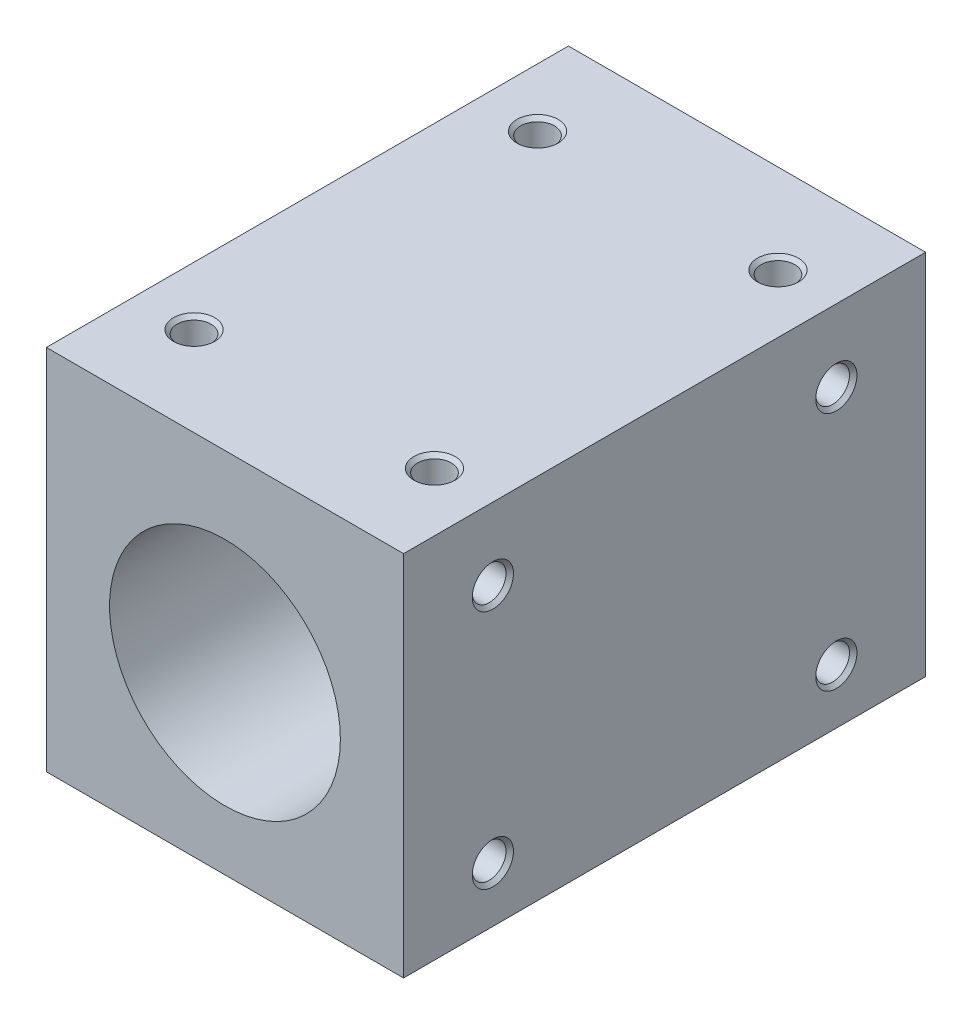
ISO-10303-21;
HEADER;
FILE_DESCRIPTION(('STEP AP214'),'2;1');
FILE_NAME('part.step','',(''),(''),'','','');
FILE_SCHEMA(('AUTOMOTIVE_DESIGN { 1 0 10303 214 1 1 1 1 }'));
ENDSEC;
DATA;
#1=APPLICATION_CONTEXT('core data for automotive mechanical design processes');
#2=APPLICATION_PROTOCOL_DEFINITION('international standard','automotive_design',2000,#1);
#3=PRODUCT_CONTEXT('',#1,'mechanical');
#4=PRODUCT('Part','Part','',(#3));
#5=PRODUCT_RELATED_PRODUCT_CATEGORY('part','',(#4));
#6=PRODUCT_DEFINITION_FORMATION('','',#4);
#7=PRODUCT_DEFINITION_CONTEXT('part definition',#1,'design');
#8=PRODUCT_DEFINITION('design','',#6,#7);
#9=PRODUCT_DEFINITION_SHAPE('','',#8);
#10=(LENGTH_UNIT() NAMED_UNIT(*) SI_UNIT(.MILLI.,.METRE.));
#11=(NAMED_UNIT(*) PLANE_ANGLE_UNIT() SI_UNIT($,.RADIAN.));
#12=(NAMED_UNIT(*) SI_UNIT($,.STERADIAN.) SOLID_ANGLE_UNIT());
#13=UNCERTAINTY_MEASURE_WITH_UNIT(LENGTH_MEASURE(1.E-05),#10,'distance_accuracy_value','');
#14=(GEOMETRIC_REPRESENTATION_CONTEXT(3) GLOBAL_UNCERTAINTY_ASSIGNED_CONTEXT((#13)) GLOBAL_UNIT_ASSIGNED_CONTEXT((#10,
#11,#12)) REPRESENTATION_CONTEXT('',''));
#15=CARTESIAN_POINT('',(0.,0.,0.));
#16=DIRECTION('',(0.,0.,1.));
#17=DIRECTION('',(1.,0.,0.));
#18=AXIS2_PLACEMENT_3D('',#15,#16,#17);
#19=CARTESIAN_POINT('',(18.9999999999486,17.5,-66.));
#20=DIRECTION('',(1.,0.,0.));
#21=DIRECTION('',(0.,0.,-1.));
#22=AXIS2_PLACEMENT_3D('',#19,#20,#21);
#23=CONICAL_SURFACE('',#22,2.45849999985921,1.04719755111137);
#24=CARTESIAN_POINT('',(17.5805843631451,17.5000000000978,-66.));
#25=VERTEX_POINT('',#24);
#26=VERTEX_LOOP('',#25);
#27=FACE_BOUND('',#26,.T.);
#28=CARTESIAN_POINT('',(19.,17.5,-66.));
#29=DIRECTION('',(1.,0.,0.));
#30=DIRECTION('',(0.,0.,-1.));
#31=AXIS2_PLACEMENT_3D('',#28,#29,#30);
#32=CIRCLE('',#31,2.4585);
#33=CARTESIAN_POINT('',(19.,17.5,-68.4585));
#34=VERTEX_POINT('',#33);
#35=EDGE_CURVE('E84',#34,#34,#32,.T.);
#36=ORIENTED_EDGE('',*,*,#35,.T.);
#37=EDGE_LOOP('',(#36));
#38=FACE_BOUND('',#37,.T.);
#39=ADVANCED_FACE('F17',(#27,#38),#23,.F.);
#40=CARTESIAN_POINT('',(18.9999999999486,-17.5,-16.));
#41=DIRECTION('',(1.,0.,0.));
#42=DIRECTION('',(0.,0.,-1.));
#43=AXIS2_PLACEMENT_3D('',#40,#41,#42);
#44=CONICAL_SURFACE('',#43,2.45849999994789,1.04719755114261);
#45=CARTESIAN_POINT('',(17.5805843631167,-17.5000000000284,-16.));
#46=VERTEX_POINT('',#45);
#47=VERTEX_LOOP('',#46);
#48=FACE_BOUND('',#47,.T.);
#49=CARTESIAN_POINT('',(19.,-17.5,-16.));
#50=DIRECTION('',(1.,0.,0.));
#51=DIRECTION('',(0.,0.,-1.));
#52=AXIS2_PLACEMENT_3D('',#49,#50,#51);
#53=CIRCLE('',#52,2.4585);
#54=CARTESIAN_POINT('',(19.,-17.5,-18.4585));
#55=VERTEX_POINT('',#54);
#56=EDGE_CURVE('E86',#55,#55,#53,.T.);
#57=ORIENTED_EDGE('',*,*,#56,.T.);
#58=EDGE_LOOP('',(#57));
#59=FACE_BOUND('',#58,.T.);
#60=ADVANCED_FACE('F81',(#48,#59),#44,.F.);
#61=CARTESIAN_POINT('',(18.9999999999486,-17.5,-66.));
#62=DIRECTION('',(1.,0.,0.));
#63=DIRECTION('',(0.,0.,-1.));
#64=AXIS2_PLACEMENT_3D('',#61,#62,#63);
#65=CONICAL_SURFACE('',#64,2.45849999994789,1.04719755114261);
#66=CARTESIAN_POINT('',(17.5805843630883,-17.4999999999273,-66.));
#67=VERTEX_POINT('',#66);
#68=VERTEX_LOOP('',#67);
#69=FACE_BOUND('',#68,.T.);
#70=CARTESIAN_POINT('',(19.,-17.5,-66.));
#71=DIRECTION('',(1.,0.,0.));
#72=DIRECTION('',(0.,0.,-1.));
#73=AXIS2_PLACEMENT_3D('',#70,#71,#72);
#74=CIRCLE('',#73,2.4585);
#75=CARTESIAN_POINT('',(19.,-17.5,-68.4585));
#76=VERTEX_POINT('',#75);
#77=EDGE_CURVE('E89',#76,#76,#74,.T.);
#78=ORIENTED_EDGE('',*,*,#77,.T.);
#79=EDGE_LOOP('',(#78));
#80=FACE_BOUND('',#79,.T.);
#81=ADVANCED_FACE('F173',(#69,#80),#65,.F.);
#82=CARTESIAN_POINT('',(18.9999999999486,17.5,-16.));
#83=DIRECTION('',(1.,0.,0.));
#84=DIRECTION('',(0.,0.,-1.));
#85=AXIS2_PLACEMENT_3D('',#82,#83,#84);
#86=CONICAL_SURFACE('',#85,2.45849999985921,1.04719755111137);
#87=CARTESIAN_POINT('',(17.5805843631167,17.4999999999432,-16.));
#88=VERTEX_POINT('',#87);
#89=VERTEX_LOOP('',#88);
#90=FACE_BOUND('',#89,.T.);
#91=CARTESIAN_POINT('',(19.,17.5,-16.));
#92=DIRECTION('',(1.,0.,0.));
#93=DIRECTION('',(0.,0.,-1.));
#94=AXIS2_PLACEMENT_3D('',#91,#92,#93);
#95=CIRCLE('',#94,2.4585);
#96=CARTESIAN_POINT('',(19.,17.5,-18.4585));
#97=VERTEX_POINT('',#96);
#98=EDGE_CURVE('E168',#97,#97,#95,.T.);
#99=ORIENTED_EDGE('',*,*,#98,.T.);
#100=EDGE_LOOP('',(#99));
#101=FACE_BOUND('',#100,.T.);
#102=ADVANCED_FACE('F281',(#90,#101),#86,.F.);
#103=CARTESIAN_POINT('',(-17.5,20.9999999999581,-16.));
#104=DIRECTION('',(0.,1.,0.));
#105=DIRECTION('',(0.,0.,1.));
#106=AXIS2_PLACEMENT_3D('',#103,#104,#105);
#107=CONICAL_SURFACE('',#106,2.45850000006158,1.04719755118266);
#108=CARTESIAN_POINT('',(-17.5,19.5805843630978,-16.));
#109=VERTEX_POINT('',#108);
#110=VERTEX_LOOP('',#109);
#111=FACE_BOUND('',#110,.T.);
#112=CARTESIAN_POINT('',(-17.5,21.,-16.));
#113=DIRECTION('',(0.,-1.,0.));
#114=DIRECTION('',(0.,0.,-1.));
#115=AXIS2_PLACEMENT_3D('',#112,#113,#114);
#116=CIRCLE('',#115,2.4585);
#117=CARTESIAN_POINT('',(-17.5,21.,-18.4585));
#118=VERTEX_POINT('',#117);
#119=EDGE_CURVE('E165',#118,#118,#116,.F.);
#120=ORIENTED_EDGE('',*,*,#119,.T.);
#121=EDGE_LOOP('',(#120));
#122=FACE_BOUND('',#121,.T.);
#123=ADVANCED_FACE('F278',(#111,#122),#107,.F.);
#124=CARTESIAN_POINT('',(17.5,20.9999999999013,-66.));
#125=DIRECTION('',(0.,1.,0.));
#126=DIRECTION('',(0.,0.,1.));
#127=AXIS2_PLACEMENT_3D('',#124,#125,#126);
#128=CONICAL_SURFACE('',#127,2.45849999985921,1.0471975511861);
#129=CARTESIAN_POINT('',(17.5000000000978,19.5805843630978,-66.));
#130=VERTEX_POINT('',#129);
#131=VERTEX_LOOP('',#130);
#132=FACE_BOUND('',#131,.T.);
#133=CARTESIAN_POINT('',(17.5,21.,-66.));
#134=DIRECTION('',(0.,-1.,0.));
#135=DIRECTION('',(0.,0.,-1.));
#136=AXIS2_PLACEMENT_3D('',#133,#134,#135);
#137=CIRCLE('',#136,2.4585);
#138=CARTESIAN_POINT('',(17.5,21.,-68.4585));
#139=VERTEX_POINT('',#138);
#140=EDGE_CURVE('E162',#139,#139,#137,.F.);
#141=ORIENTED_EDGE('',*,*,#140,.T.);
#142=EDGE_LOOP('',(#141));
#143=FACE_BOUND('',#142,.T.);
#144=ADVANCED_FACE('F280',(#132,#143),#128,.F.);
#145=CARTESIAN_POINT('',(-17.5,20.9999999999581,-66.));
#146=DIRECTION('',(0.,1.,0.));
#147=DIRECTION('',(0.,0.,1.));
#148=AXIS2_PLACEMENT_3D('',#145,#146,#147);
#149=CONICAL_SURFACE('',#148,2.45850000006158,1.04719755118266);
#150=CARTESIAN_POINT('',(-17.4999999998704,19.5805843630694,-66.));
#151=VERTEX_POINT('',#150);
#152=VERTEX_LOOP('',#151);
#153=FACE_BOUND('',#152,.T.);
#154=CARTESIAN_POINT('',(-17.5,21.,-66.));
#155=DIRECTION('',(0.,-1.,0.));
#156=DIRECTION('',(0.,0.,-1.));
#157=AXIS2_PLACEMENT_3D('',#154,#155,#156);
#158=CIRCLE('',#157,2.4585);
#159=CARTESIAN_POINT('',(-17.5,21.,-68.4585));
#160=VERTEX_POINT('',#159);
#161=EDGE_CURVE('E159',#160,#160,#158,.F.);
#162=ORIENTED_EDGE('',*,*,#161,.T.);
#163=EDGE_LOOP('',(#162));
#164=FACE_BOUND('',#163,.T.);
#165=ADVANCED_FACE('F289',(#153,#164),#149,.F.);
#166=CARTESIAN_POINT('',(17.5,20.9999999999013,-16.));
#167=DIRECTION('',(0.,1.,0.));
#168=DIRECTION('',(0.,0.,1.));
#169=AXIS2_PLACEMENT_3D('',#166,#167,#168);
#170=CONICAL_SURFACE('',#169,2.45849999985921,1.0471975511861);
#171=CARTESIAN_POINT('',(17.5,19.5805843631547,-16.));
#172=VERTEX_POINT('',#171);
#173=VERTEX_LOOP('',#172);
#174=FACE_BOUND('',#173,.T.);
#175=CARTESIAN_POINT('',(17.5,21.,-16.));
#176=DIRECTION('',(0.,-1.,0.));
#177=DIRECTION('',(0.,0.,-1.));
#178=AXIS2_PLACEMENT_3D('',#175,#176,#177);
#179=CIRCLE('',#178,2.4585);
#180=CARTESIAN_POINT('',(17.5,21.,-18.4585));
#181=VERTEX_POINT('',#180);
#182=EDGE_CURVE('E156',#181,#181,#179,.F.);
#183=ORIENTED_EDGE('',*,*,#182,.T.);
#184=EDGE_LOOP('',(#183));
#185=FACE_BOUND('',#184,.T.);
#186=ADVANCED_FACE('F474',(#174,#185),#170,.F.);
#187=CARTESIAN_POINT('',(22.22925,17.5,-66.));
#188=DIRECTION('',(1.,0.,0.));
#189=DIRECTION('',(0.,0.,-1.));
#190=AXIS2_PLACEMENT_3D('',#187,#188,#189);
#191=CYLINDRICAL_SURFACE('',#190,2.4585);
#192=CARTESIAN_POINT('',(25.4585000000134,17.5,-66.));
#193=DIRECTION('',(1.,0.,0.));
#194=DIRECTION('',(0.,1.,0.));
#195=AXIS2_PLACEMENT_3D('',#192,#193,#194);
#196=CIRCLE('',#195,2.45850000002975);
#197=CARTESIAN_POINT('',(25.4585000000134,19.9585000000297,-66.));
#198=VERTEX_POINT('',#197);
#199=EDGE_CURVE('E153',#198,#198,#196,.T.);
#200=ORIENTED_EDGE('',*,*,#199,.T.);
#201=EDGE_LOOP('',(#200));
#202=FACE_BOUND('',#201,.T.);
#203=ORIENTED_EDGE('',*,*,#35,.F.);
#204=EDGE_LOOP('',(#203));
#205=FACE_BOUND('',#204,.T.);
#206=ADVANCED_FACE('F190',(#202,#205),#191,.F.);
#207=CARTESIAN_POINT('',(22.22925,-17.5,-16.));
#208=DIRECTION('',(1.,0.,0.));
#209=DIRECTION('',(0.,0.,-1.));
#210=AXIS2_PLACEMENT_3D('',#207,#208,#209);
#211=CYLINDRICAL_SURFACE('',#210,2.4585);
#212=CARTESIAN_POINT('',(25.4585000000134,-17.5,-16.));
#213=DIRECTION('',(1.,0.,0.));
#214=DIRECTION('',(0.,1.,0.));
#215=AXIS2_PLACEMENT_3D('',#212,#213,#214);
#216=CIRCLE('',#215,2.45850000000474);
#217=CARTESIAN_POINT('',(25.4585000000134,-15.0414999999953,-16.));
#218=VERTEX_POINT('',#217);
#219=EDGE_CURVE('E150',#218,#218,#216,.T.);
#220=ORIENTED_EDGE('',*,*,#219,.T.);
#221=EDGE_LOOP('',(#220));
#222=FACE_BOUND('',#221,.T.);
#223=ORIENTED_EDGE('',*,*,#56,.F.);
#224=EDGE_LOOP('',(#223));
#225=FACE_BOUND('',#224,.T.);
#226=ADVANCED_FACE('F178',(#222,#225),#211,.F.);
#227=CARTESIAN_POINT('',(22.22925,-17.5,-66.));
#228=DIRECTION('',(1.,0.,0.));
#229=DIRECTION('',(0.,0.,-1.));
#230=AXIS2_PLACEMENT_3D('',#227,#228,#229);
#231=CYLINDRICAL_SURFACE('',#230,2.4585);
#232=CARTESIAN_POINT('',(25.4585000000134,-17.5,-66.));
#233=DIRECTION('',(1.,0.,0.));
#234=DIRECTION('',(0.,1.,0.));
#235=AXIS2_PLACEMENT_3D('',#232,#233,#234);
#236=CIRCLE('',#235,2.45850000000474);
#237=CARTESIAN_POINT('',(25.4585000000134,-15.0414999999953,-66.));
#238=VERTEX_POINT('',#237);
#239=EDGE_CURVE('E147',#238,#238,#236,.T.);
#240=ORIENTED_EDGE('',*,*,#239,.T.);
#241=EDGE_LOOP('',(#240));
#242=FACE_BOUND('',#241,.T.);
#243=ORIENTED_EDGE('',*,*,#77,.F.);
#244=EDGE_LOOP('',(#243));
#245=FACE_BOUND('',#244,.T.);
#246=ADVANCED_FACE('F175',(#242,#245),#231,.F.);
#247=CARTESIAN_POINT('',(22.22925,17.5,-16.));
#248=DIRECTION('',(1.,0.,0.));
#249=DIRECTION('',(0.,0.,-1.));
#250=AXIS2_PLACEMENT_3D('',#247,#248,#249);
#251=CYLINDRICAL_SURFACE('',#250,2.4585);
#252=CARTESIAN_POINT('',(25.4585000000134,17.5,-16.));
#253=DIRECTION('',(1.,0.,0.));
#254=DIRECTION('',(0.,1.,0.));
#255=AXIS2_PLACEMENT_3D('',#252,#253,#254);
#256=CIRCLE('',#255,2.45850000002975);
#257=CARTESIAN_POINT('',(25.4585000000134,19.9585000000297,-16.));
#258=VERTEX_POINT('',#257);
#259=EDGE_CURVE('E144',#258,#258,#256,.T.);
#260=ORIENTED_EDGE('',*,*,#259,.T.);
#261=EDGE_LOOP('',(#260));
#262=FACE_BOUND('',#261,.T.);
#263=ORIENTED_EDGE('',*,*,#98,.F.);
#264=EDGE_LOOP('',(#263));
#265=FACE_BOUND('',#264,.T.);
#266=ADVANCED_FACE('F177',(#262,#265),#251,.F.);
#267=CARTESIAN_POINT('',(-17.5,24.22925,-16.));
#268=DIRECTION('',(0.,-1.,0.));
#269=DIRECTION('',(0.,0.,-1.));
#270=AXIS2_PLACEMENT_3D('',#267,#268,#269);
#271=CYLINDRICAL_SURFACE('',#270,2.4585);
#272=CARTESIAN_POINT('',(-17.5,27.458500000023,-16.));
#273=DIRECTION('',(0.,1.,0.));
#274=DIRECTION('',(1.,0.,0.));
#275=AXIS2_PLACEMENT_3D('',#272,#273,#274);
#276=CIRCLE('',#275,2.45849999994789);
#277=CARTESIAN_POINT('',(-15.0415000000521,27.458500000023,-16.));
#278=VERTEX_POINT('',#277);
#279=EDGE_CURVE('E141',#278,#278,#276,.T.);
#280=ORIENTED_EDGE('',*,*,#279,.T.);
#281=EDGE_LOOP('',(#280));
#282=FACE_BOUND('',#281,.T.);
#283=ORIENTED_EDGE('',*,*,#119,.F.);
#284=EDGE_LOOP('',(#283));
#285=FACE_BOUND('',#284,.T.);
#286=ADVANCED_FACE('F187',(#282,#285),#271,.F.);
#287=CARTESIAN_POINT('',(17.5,24.22925,-66.));
#288=DIRECTION('',(0.,-1.,0.));
#289=DIRECTION('',(0.,0.,-1.));
#290=AXIS2_PLACEMENT_3D('',#287,#288,#289);
#291=CYLINDRICAL_SURFACE('',#290,2.4585);
#292=CARTESIAN_POINT('',(17.5,27.458500000023,-66.));
#293=DIRECTION('',(0.,1.,0.));
#294=DIRECTION('',(1.,0.,0.));
#295=AXIS2_PLACEMENT_3D('',#292,#293,#294);
#296=CIRCLE('',#295,2.4584999999729);
#297=CARTESIAN_POINT('',(19.9584999999729,27.458500000023,-66.));
#298=VERTEX_POINT('',#297);
#299=EDGE_CURVE('E134',#298,#298,#296,.T.);
#300=ORIENTED_EDGE('',*,*,#299,.T.);
#301=EDGE_LOOP('',(#300));
#302=FACE_BOUND('',#301,.T.);
#303=ORIENTED_EDGE('',*,*,#140,.F.);
#304=EDGE_LOOP('',(#303));
#305=FACE_BOUND('',#304,.T.);
#306=ADVANCED_FACE('F264',(#302,#305),#291,.F.);
#307=CARTESIAN_POINT('',(-17.5,24.22925,-66.));
#308=DIRECTION('',(0.,-1.,0.));
#309=DIRECTION('',(0.,0.,-1.));
#310=AXIS2_PLACEMENT_3D('',#307,#308,#309);
#311=CYLINDRICAL_SURFACE('',#310,2.4585);
#312=CARTESIAN_POINT('',(-17.5,27.458500000023,-66.));
#313=DIRECTION('',(0.,1.,0.));
#314=DIRECTION('',(1.,0.,0.));
#315=AXIS2_PLACEMENT_3D('',#312,#313,#314);
#316=CIRCLE('',#315,2.45849999994789);
#317=CARTESIAN_POINT('',(-15.0415000000521,27.458500000023,-66.));
#318=VERTEX_POINT('',#317);
#319=EDGE_CURVE('E129',#318,#318,#316,.T.);
#320=ORIENTED_EDGE('',*,*,#319,.T.);
#321=EDGE_LOOP('',(#320));
#322=FACE_BOUND('',#321,.T.);
#323=ORIENTED_EDGE('',*,*,#161,.F.);
#324=EDGE_LOOP('',(#323));
#325=FACE_BOUND('',#324,.T.);
#326=ADVANCED_FACE('F261',(#322,#325),#311,.F.);
#327=CARTESIAN_POINT('',(17.5,24.22925,-16.));
#328=DIRECTION('',(0.,-1.,0.));
#329=DIRECTION('',(0.,0.,-1.));
#330=AXIS2_PLACEMENT_3D('',#327,#328,#329);
#331=CYLINDRICAL_SURFACE('',#330,2.4585);
#332=CARTESIAN_POINT('',(17.5,27.458500000023,-16.));
#333=DIRECTION('',(0.,1.,0.));
#334=DIRECTION('',(1.,0.,0.));
#335=AXIS2_PLACEMENT_3D('',#332,#333,#334);
#336=CIRCLE('',#335,2.4584999999729);
#337=CARTESIAN_POINT('',(19.9584999999729,27.458500000023,-16.));
#338=VERTEX_POINT('',#337);
#339=EDGE_CURVE('E125',#338,#338,#336,.T.);
#340=ORIENTED_EDGE('',*,*,#339,.T.);
#341=EDGE_LOOP('',(#340));
#342=FACE_BOUND('',#341,.T.);
#343=ORIENTED_EDGE('',*,*,#182,.F.);
#344=EDGE_LOOP('',(#343));
#345=FACE_BOUND('',#344,.T.);
#346=ADVANCED_FACE('F257',(#342,#345),#331,.F.);
#347=CARTESIAN_POINT('',(25.9999999999536,17.5,-66.));
#348=DIRECTION('',(1.,0.,0.));
#349=DIRECTION('',(0.,0.,-1.));
#350=AXIS2_PLACEMENT_3D('',#347,#348,#349);
#351=CONICAL_SURFACE('',#350,2.99999999996998,0.785398163397448);
#352=CARTESIAN_POINT('',(26.0000000000104,17.5,-66.));
#353=DIRECTION('',(1.,0.,0.));
#354=DIRECTION('',(0.,0.,-1.));
#355=AXIS2_PLACEMENT_3D('',#352,#353,#354);
#356=CIRCLE('',#355,3.00000000002683);
#357=CARTESIAN_POINT('',(26.0000000000104,17.5,-69.0000000000268));
#358=VERTEX_POINT('',#357);
#359=EDGE_CURVE('E20',#358,#358,#356,.F.);
#360=ORIENTED_EDGE('',*,*,#359,.F.);
#361=EDGE_LOOP('',(#360));
#362=FACE_BOUND('',#361,.T.);
#363=ORIENTED_EDGE('',*,*,#199,.F.);
#364=EDGE_LOOP('',(#363));
#365=FACE_BOUND('',#364,.T.);
#366=ADVANCED_FACE('F253',(#362,#365),#351,.F.);
#367=CARTESIAN_POINT('',(25.9999999999536,-17.5,-16.));
#368=DIRECTION('',(1.,0.,0.));
#369=DIRECTION('',(0.,0.,-1.));
#370=AXIS2_PLACEMENT_3D('',#367,#368,#369);
#371=CONICAL_SURFACE('',#370,2.99999999994498,0.785398163397448);
#372=CARTESIAN_POINT('',(26.0000000000104,-17.5,-16.));
#373=DIRECTION('',(1.,0.,0.));
#374=DIRECTION('',(0.,0.,-1.));
#375=AXIS2_PLACEMENT_3D('',#372,#373,#374);
#376=CIRCLE('',#375,3.00000000000182);
#377=CARTESIAN_POINT('',(26.0000000000104,-17.5,-19.0000000000018));
#378=VERTEX_POINT('',#377);
#379=EDGE_CURVE('E120',#378,#378,#376,.F.);
#380=ORIENTED_EDGE('',*,*,#379,.F.);
#381=EDGE_LOOP('',(#380));
#382=FACE_BOUND('',#381,.T.);
#383=ORIENTED_EDGE('',*,*,#219,.F.);
#384=EDGE_LOOP('',(#383));
#385=FACE_BOUND('',#384,.T.);
#386=ADVANCED_FACE('F249',(#382,#385),#371,.F.);
#387=CARTESIAN_POINT('',(25.9999999999536,-17.5,-66.));
#388=DIRECTION('',(1.,0.,0.));
#389=DIRECTION('',(0.,0.,-1.));
#390=AXIS2_PLACEMENT_3D('',#387,#388,#389);
#391=CONICAL_SURFACE('',#390,2.99999999994498,0.785398163397448);
#392=CARTESIAN_POINT('',(26.0000000000104,-17.5,-66.));
#393=DIRECTION('',(1.,0.,0.));
#394=DIRECTION('',(0.,0.,-1.));
#395=AXIS2_PLACEMENT_3D('',#392,#393,#394);
#396=CIRCLE('',#395,3.00000000000182);
#397=CARTESIAN_POINT('',(26.0000000000104,-17.5,-69.0000000000018));
#398=VERTEX_POINT('',#397);
#399=EDGE_CURVE('E118',#398,#398,#396,.F.);
#400=ORIENTED_EDGE('',*,*,#399,.F.);
#401=EDGE_LOOP('',(#400));
#402=FACE_BOUND('',#401,.T.);
#403=ORIENTED_EDGE('',*,*,#239,.F.);
#404=EDGE_LOOP('',(#403));
#405=FACE_BOUND('',#404,.T.);
#406=ADVANCED_FACE('F245',(#402,#405),#391,.F.);
#407=CARTESIAN_POINT('',(25.9999999999536,17.5,-16.));
#408=DIRECTION('',(1.,0.,0.));
#409=DIRECTION('',(0.,0.,-1.));
#410=AXIS2_PLACEMENT_3D('',#407,#408,#409);
#411=CONICAL_SURFACE('',#410,2.99999999996998,0.785398163397448);
#412=CARTESIAN_POINT('',(26.0000000000104,17.5,-16.));
#413=DIRECTION('',(1.,0.,0.));
#414=DIRECTION('',(0.,0.,-1.));
#415=AXIS2_PLACEMENT_3D('',#412,#413,#414);
#416=CIRCLE('',#415,3.00000000002683);
#417=CARTESIAN_POINT('',(26.0000000000104,17.5,-19.0000000000268));
#418=VERTEX_POINT('',#417);
#419=EDGE_CURVE('E115',#418,#418,#416,.F.);
#420=ORIENTED_EDGE('',*,*,#419,.F.);
#421=EDGE_LOOP('',(#420));
#422=FACE_BOUND('',#421,.T.);
#423=ORIENTED_EDGE('',*,*,#259,.F.);
#424=EDGE_LOOP('',(#423));
#425=FACE_BOUND('',#424,.T.);
#426=ADVANCED_FACE('F241',(#422,#425),#411,.F.);
#427=CARTESIAN_POINT('',(0.,0.,-3.));
#428=DIRECTION('',(0.,0.,1.));
#429=DIRECTION('',(1.,0.,0.));
#430=AXIS2_PLACEMENT_3D('',#427,#428,#429);
#431=CYLINDRICAL_SURFACE('',#430,16.8);
#432=CARTESIAN_POINT('',(0.,0.,-79.));
#433=DIRECTION('',(0.,0.,1.));
#434=DIRECTION('',(1.,0.,0.));
#435=AXIS2_PLACEMENT_3D('',#432,#433,#434);
#436=CIRCLE('',#435,16.8);
#437=CARTESIAN_POINT('',(16.8,0.,-79.));
#438=VERTEX_POINT('',#437);
#439=EDGE_CURVE('E110',#438,#438,#436,.F.);
#440=ORIENTED_EDGE('',*,*,#439,.T.);
#441=EDGE_LOOP('',(#440));
#442=FACE_BOUND('',#441,.T.);
#443=CARTESIAN_POINT('',(0.,0.,-3.));
#444=DIRECTION('',(0.,0.,1.));
#445=DIRECTION('',(1.,0.,0.));
#446=AXIS2_PLACEMENT_3D('',#443,#444,#445);
#447=CIRCLE('',#446,16.8);
#448=CARTESIAN_POINT('',(16.8,0.,-3.));
#449=VERTEX_POINT('',#448);
#450=EDGE_CURVE('E106',#449,#449,#447,.F.);
#451=ORIENTED_EDGE('',*,*,#450,.F.);
#452=EDGE_LOOP('',(#451));
#453=FACE_BOUND('',#452,.T.);
#454=ADVANCED_FACE('F237',(#442,#453),#431,.F.);
#455=CARTESIAN_POINT('',(-17.5,28.00000000002,-16.));
#456=DIRECTION('',(0.,1.,0.));
#457=DIRECTION('',(0.,0.,1.));
#458=AXIS2_PLACEMENT_3D('',#455,#456,#457);
#459=CONICAL_SURFACE('',#458,2.99999999994498,0.785398163397448);
#460=CARTESIAN_POINT('',(-17.5,28.0000000000769,-16.));
#461=DIRECTION('',(0.,1.,0.));
#462=DIRECTION('',(0.,0.,1.));
#463=AXIS2_PLACEMENT_3D('',#460,#461,#462);
#464=CIRCLE('',#463,3.00000000000182);
#465=CARTESIAN_POINT('',(-17.5,28.0000000000769,-12.9999999999982));
#466=VERTEX_POINT('',#465);
#467=EDGE_CURVE('E103',#466,#466,#464,.F.);
#468=ORIENTED_EDGE('',*,*,#467,.F.);
#469=EDGE_LOOP('',(#468));
#470=FACE_BOUND('',#469,.T.);
#471=ORIENTED_EDGE('',*,*,#279,.F.);
#472=EDGE_LOOP('',(#471));
#473=FACE_BOUND('',#472,.T.);
#474=ADVANCED_FACE('F233',(#470,#473),#459,.F.);
#475=CARTESIAN_POINT('',(17.5,27.9999999999063,-66.));
#476=DIRECTION('',(0.,1.,0.));
#477=DIRECTION('',(0.,0.,1.));
#478=AXIS2_PLACEMENT_3D('',#475,#476,#477);
#479=CONICAL_SURFACE('',#478,2.9999999998563,0.785398163397448);
#480=CARTESIAN_POINT('',(17.5,28.00000000002,-66.));
#481=DIRECTION('',(0.,1.,0.));
#482=DIRECTION('',(0.,0.,1.));
#483=AXIS2_PLACEMENT_3D('',#480,#481,#482);
#484=CIRCLE('',#483,2.99999999996998);
#485=CARTESIAN_POINT('',(17.5,28.00000000002,-63.00000000003));
#486=VERTEX_POINT('',#485);
#487=EDGE_CURVE('E100',#486,#486,#484,.F.);
#488=ORIENTED_EDGE('',*,*,#487,.F.);
#489=EDGE_LOOP('',(#488));
#490=FACE_BOUND('',#489,.T.);
#491=ORIENTED_EDGE('',*,*,#299,.F.);
#492=EDGE_LOOP('',(#491));
#493=FACE_BOUND('',#492,.T.);
#494=ADVANCED_FACE('F229',(#490,#493),#479,.F.);
#495=CARTESIAN_POINT('',(-17.5,28.00000000002,-66.));
#496=DIRECTION('',(0.,1.,0.));
#497=DIRECTION('',(0.,0.,1.));
#498=AXIS2_PLACEMENT_3D('',#495,#496,#497);
#499=CONICAL_SURFACE('',#498,2.99999999994498,0.785398163397448);
#500=CARTESIAN_POINT('',(-17.5,28.0000000000769,-66.));
#501=DIRECTION('',(0.,1.,0.));
#502=DIRECTION('',(0.,0.,1.));
#503=AXIS2_PLACEMENT_3D('',#500,#501,#502);
#504=CIRCLE('',#503,3.00000000000182);
#505=CARTESIAN_POINT('',(-17.5,28.0000000000769,-62.9999999999982));
#506=VERTEX_POINT('',#505);
#507=EDGE_CURVE('E97',#506,#506,#504,.F.);
#508=ORIENTED_EDGE('',*,*,#507,.F.);
#509=EDGE_LOOP('',(#508));
#510=FACE_BOUND('',#509,.T.);
#511=ORIENTED_EDGE('',*,*,#319,.F.);
#512=EDGE_LOOP('',(#511));
#513=FACE_BOUND('',#512,.T.);
#514=ADVANCED_FACE('F225',(#510,#513),#499,.F.);
#515=CARTESIAN_POINT('',(17.5,27.9999999999063,-16.));
#516=DIRECTION('',(0.,1.,0.));
#517=DIRECTION('',(0.,0.,1.));
#518=AXIS2_PLACEMENT_3D('',#515,#516,#517);
#519=CONICAL_SURFACE('',#518,2.9999999998563,0.785398163397448);
#520=CARTESIAN_POINT('',(17.5,28.00000000002,-16.));
#521=DIRECTION('',(0.,1.,0.));
#522=DIRECTION('',(0.,0.,1.));
#523=AXIS2_PLACEMENT_3D('',#520,#521,#522);
#524=CIRCLE('',#523,2.99999999996998);
#525=CARTESIAN_POINT('',(17.5,28.00000000002,-13.00000000003));
#526=VERTEX_POINT('',#525);
#527=EDGE_CURVE('E93',#526,#526,#524,.F.);
#528=ORIENTED_EDGE('',*,*,#527,.F.);
#529=EDGE_LOOP('',(#528));
#530=FACE_BOUND('',#529,.T.);
#531=ORIENTED_EDGE('',*,*,#339,.F.);
#532=EDGE_LOOP('',(#531));
#533=FACE_BOUND('',#532,.T.);
#534=ADVANCED_FACE('F221',(#530,#533),#519,.F.);
#535=CARTESIAN_POINT('',(26.,-25.5,-3.));
#536=DIRECTION('',(1.,0.,0.));
#537=DIRECTION('',(0.,0.,-1.));
#538=AXIS2_PLACEMENT_3D('',#535,#536,#537);
#539=PLANE('',#538);
#540=DIRECTION('',(0.,1.,0.));
#541=VECTOR('',#540,1.);
#542=CARTESIAN_POINT('',(26.,0.,-3.));
#543=LINE('',#542,#541);
#544=CARTESIAN_POINT('',(26.,-25.5,-3.));
#545=VERTEX_POINT('',#544);
#546=CARTESIAN_POINT('',(26.,28.,-3.));
#547=VERTEX_POINT('',#546);
#548=EDGE_CURVE('E109',#545,#547,#543,.T.);
#549=ORIENTED_EDGE('',*,*,#548,.F.);
#550=DIRECTION('',(0.,0.,-1.));
#551=VECTOR('',#550,1.);
#552=CARTESIAN_POINT('',(26.,-25.5,-3.));
#553=LINE('',#552,#551);
#554=CARTESIAN_POINT('',(26.,-25.5,-79.));
#555=VERTEX_POINT('',#554);
#556=EDGE_CURVE('E542',#555,#545,#553,.F.);
#557=ORIENTED_EDGE('',*,*,#556,.F.);
#558=DIRECTION('',(0.,1.,0.));
#559=VECTOR('',#558,1.);
#560=CARTESIAN_POINT('',(26.,0.,-79.));
#561=LINE('',#560,#559);
#562=CARTESIAN_POINT('',(26.,28.,-79.));
#563=VERTEX_POINT('',#562);
#564=EDGE_CURVE('E114',#555,#563,#561,.T.);
#565=ORIENTED_EDGE('',*,*,#564,.T.);
#566=DIRECTION('',(0.,0.,1.));
#567=VECTOR('',#566,1.);
#568=CARTESIAN_POINT('',(26.,28.,-3.));
#569=LINE('',#568,#567);
#570=EDGE_CURVE('E531',#547,#563,#569,.F.);
#571=ORIENTED_EDGE('',*,*,#570,.F.);
#572=EDGE_LOOP('',(#549,#557,#565,#571));
#573=FACE_BOUND('',#572,.T.);
#574=ORIENTED_EDGE('',*,*,#419,.T.);
#575=EDGE_LOOP('',(#574));
#576=FACE_BOUND('',#575,.T.);
#577=ORIENTED_EDGE('',*,*,#399,.T.);
#578=EDGE_LOOP('',(#577));
#579=FACE_BOUND('',#578,.T.);
#580=ORIENTED_EDGE('',*,*,#379,.T.);
#581=EDGE_LOOP('',(#580));
#582=FACE_BOUND('',#581,.T.);
#583=ORIENTED_EDGE('',*,*,#359,.T.);
#584=EDGE_LOOP('',(#583));
#585=FACE_BOUND('',#584,.T.);
#586=ADVANCED_FACE('F217',(#573,#576,#579,#582,#585),#539,.T.);
#587=CARTESIAN_POINT('',(0.,0.,-79.));
#588=DIRECTION('',(0.,0.,1.));
#589=DIRECTION('',(1.,0.,0.));
#590=AXIS2_PLACEMENT_3D('',#587,#588,#589);
#591=PLANE('',#590);
#592=ORIENTED_EDGE('',*,*,#439,.F.);
#593=EDGE_LOOP('',(#592));
#594=FACE_BOUND('',#593,.T.);
#595=DIRECTION('',(0.,1.,0.));
#596=VECTOR('',#595,1.);
#597=CARTESIAN_POINT('',(-26.,28.,-79.));
#598=LINE('',#597,#596);
#599=CARTESIAN_POINT('',(-26.,28.,-79.));
#600=VERTEX_POINT('',#599);
#601=CARTESIAN_POINT('',(-26.,-25.5,-79.));
#602=VERTEX_POINT('',#601);
#603=EDGE_CURVE('E534',#600,#602,#598,.F.);
#604=ORIENTED_EDGE('',*,*,#603,.F.);
#605=DIRECTION('',(1.,0.,0.));
#606=VECTOR('',#605,1.);
#607=CARTESIAN_POINT('',(26.,28.,-79.));
#608=LINE('',#607,#606);
#609=EDGE_CURVE('E96',#563,#600,#608,.F.);
#610=ORIENTED_EDGE('',*,*,#609,.F.);
#611=ORIENTED_EDGE('',*,*,#564,.F.);
#612=DIRECTION('',(1.,0.,0.));
#613=VECTOR('',#612,1.);
#614=CARTESIAN_POINT('',(-26.,-25.5,-79.));
#615=LINE('',#614,#613);
#616=EDGE_CURVE('E113',#602,#555,#615,.T.);
#617=ORIENTED_EDGE('',*,*,#616,.F.);
#618=EDGE_LOOP('',(#604,#610,#611,#617));
#619=FACE_BOUND('',#618,.T.);
#620=ADVANCED_FACE('F213',(#594,#619),#591,.F.);
#621=CARTESIAN_POINT('',(-26.,-25.5,-3.));
#622=DIRECTION('',(0.,-1.,0.));
#623=DIRECTION('',(0.,0.,-1.));
#624=AXIS2_PLACEMENT_3D('',#621,#622,#623);
#625=PLANE('',#624);
#626=DIRECTION('',(1.,0.,0.));
#627=VECTOR('',#626,1.);
#628=CARTESIAN_POINT('',(0.,-25.5,-3.));
#629=LINE('',#628,#627);
#630=CARTESIAN_POINT('',(-26.,-25.5,-3.));
#631=VERTEX_POINT('',#630);
#632=EDGE_CURVE('E527',#631,#545,#629,.T.);
#633=ORIENTED_EDGE('',*,*,#632,.F.);
#634=DIRECTION('',(0.,0.,1.));
#635=VECTOR('',#634,1.);
#636=CARTESIAN_POINT('',(-26.,-25.5,-3.));
#637=LINE('',#636,#635);
#638=EDGE_CURVE('E546',#602,#631,#637,.T.);
#639=ORIENTED_EDGE('',*,*,#638,.F.);
#640=ORIENTED_EDGE('',*,*,#616,.T.);
#641=ORIENTED_EDGE('',*,*,#556,.T.);
#642=EDGE_LOOP('',(#633,#639,#640,#641));
#643=FACE_BOUND('',#642,.T.);
#644=ADVANCED_FACE('F209',(#643),#625,.T.);
#645=CARTESIAN_POINT('',(0.,0.,-3.));
#646=DIRECTION('',(0.,0.,1.));
#647=DIRECTION('',(1.,0.,0.));
#648=AXIS2_PLACEMENT_3D('',#645,#646,#647);
#649=PLANE('',#648);
#650=ORIENTED_EDGE('',*,*,#450,.T.);
#651=EDGE_LOOP('',(#650));
#652=FACE_BOUND('',#651,.T.);
#653=ORIENTED_EDGE('',*,*,#548,.T.);
#654=DIRECTION('',(1.,0.,0.));
#655=VECTOR('',#654,1.);
#656=CARTESIAN_POINT('',(26.,28.,-3.));
#657=LINE('',#656,#655);
#658=CARTESIAN_POINT('',(-26.,28.,-3.));
#659=VERTEX_POINT('',#658);
#660=EDGE_CURVE('E35',#659,#547,#657,.T.);
#661=ORIENTED_EDGE('',*,*,#660,.F.);
#662=DIRECTION('',(0.,1.,0.));
#663=VECTOR('',#662,1.);
#664=CARTESIAN_POINT('',(-26.,28.,-3.));
#665=LINE('',#664,#663);
#666=EDGE_CURVE('E26',#631,#659,#665,.T.);
#667=ORIENTED_EDGE('',*,*,#666,.F.);
#668=ORIENTED_EDGE('',*,*,#632,.T.);
#669=EDGE_LOOP('',(#653,#661,#667,#668));
#670=FACE_BOUND('',#669,.T.);
#671=ADVANCED_FACE('F202',(#652,#670),#649,.T.);
#672=CARTESIAN_POINT('',(26.,28.,-3.));
#673=DIRECTION('',(0.,1.,0.));
#674=DIRECTION('',(0.,0.,1.));
#675=AXIS2_PLACEMENT_3D('',#672,#673,#674);
#676=PLANE('',#675);
#677=ORIENTED_EDGE('',*,*,#660,.T.);
#678=ORIENTED_EDGE('',*,*,#570,.T.);
#679=ORIENTED_EDGE('',*,*,#609,.T.);
#680=DIRECTION('',(0.,0.,1.));
#681=VECTOR('',#680,1.);
#682=CARTESIAN_POINT('',(-26.,28.,-3.));
#683=LINE('',#682,#681);
#684=EDGE_CURVE('E11',#659,#600,#683,.F.);
#685=ORIENTED_EDGE('',*,*,#684,.F.);
#686=EDGE_LOOP('',(#677,#678,#679,#685));
#687=FACE_BOUND('',#686,.T.);
#688=ORIENTED_EDGE('',*,*,#527,.T.);
#689=EDGE_LOOP('',(#688));
#690=FACE_BOUND('',#689,.T.);
#691=ORIENTED_EDGE('',*,*,#507,.T.);
#692=EDGE_LOOP('',(#691));
#693=FACE_BOUND('',#692,.T.);
#694=ORIENTED_EDGE('',*,*,#487,.T.);
#695=EDGE_LOOP('',(#694));
#696=FACE_BOUND('',#695,.T.);
#697=ORIENTED_EDGE('',*,*,#467,.T.);
#698=EDGE_LOOP('',(#697));
#699=FACE_BOUND('',#698,.T.);
#700=ADVANCED_FACE('F195',(#687,#690,#693,#696,#699),#676,.T.);
#701=CARTESIAN_POINT('',(-26.,28.,-3.));
#702=DIRECTION('',(-1.,0.,0.));
#703=DIRECTION('',(0.,0.,1.));
#704=AXIS2_PLACEMENT_3D('',#701,#702,#703);
#705=PLANE('',#704);
#706=ORIENTED_EDGE('',*,*,#666,.T.);
#707=ORIENTED_EDGE('',*,*,#684,.T.);
#708=ORIENTED_EDGE('',*,*,#603,.T.);
#709=ORIENTED_EDGE('',*,*,#638,.T.);
#710=EDGE_LOOP('',(#706,#707,#708,#709));
#711=FACE_BOUND('',#710,.T.);
#712=ADVANCED_FACE('F193',(#711),#705,.T.);
#713=CLOSED_SHELL('',(#39,#60,#81,#102,#123,#144,#165,#186,#206,#226,#246,#266,#286,#306,#326,
#346,#366,#386,#406,#426,#454,#474,#494,#514,#534,#586,#620,#644,#671,#700,#712));
#714=MANIFOLD_SOLID_BREP('B1',#713);
#715=ADVANCED_BREP_SHAPE_REPRESENTATION('',(#18,#714),#14);
#716=SHAPE_DEFINITION_REPRESENTATION(#9,#715);
ENDSEC;
END-ISO-10303-21;
